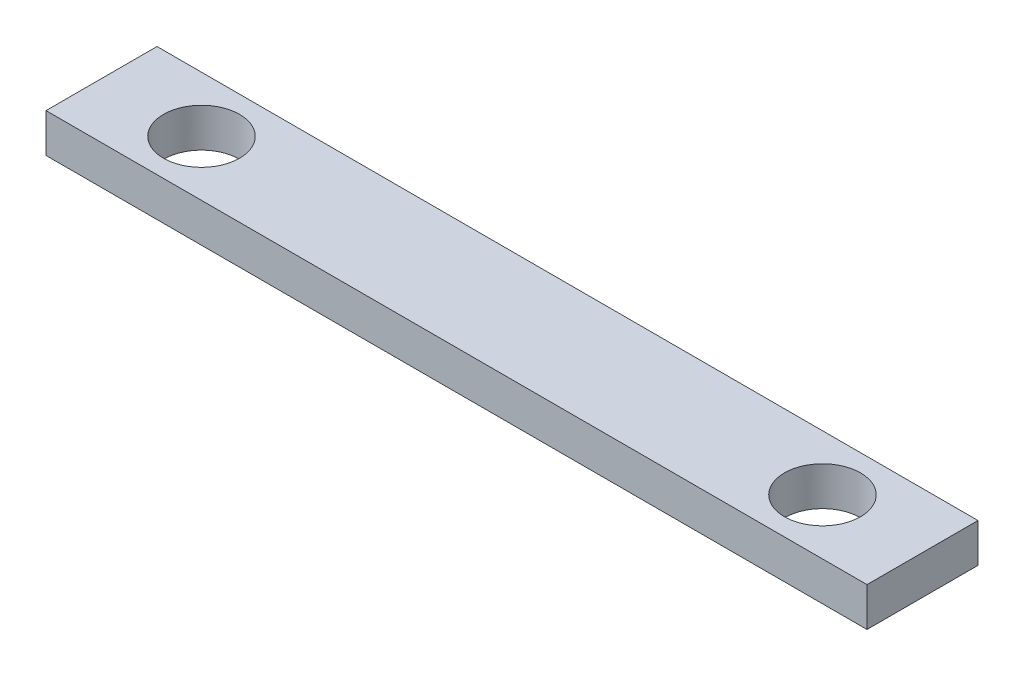
ISO-10303-21;
HEADER;
FILE_DESCRIPTION(('STEP AP214'),'2;1');
FILE_NAME('part.step','',(''),(''),'','','');
FILE_SCHEMA(('AUTOMOTIVE_DESIGN { 1 0 10303 214 1 1 1 1 }'));
ENDSEC;
DATA;
#1=APPLICATION_CONTEXT('core data for automotive mechanical design processes');
#2=APPLICATION_PROTOCOL_DEFINITION('international standard','automotive_design',2000,#1);
#3=PRODUCT_CONTEXT('',#1,'mechanical');
#4=PRODUCT('Part','Part','',(#3));
#5=PRODUCT_RELATED_PRODUCT_CATEGORY('part','',(#4));
#6=PRODUCT_DEFINITION_FORMATION('','',#4);
#7=PRODUCT_DEFINITION_CONTEXT('part definition',#1,'design');
#8=PRODUCT_DEFINITION('design','',#6,#7);
#9=PRODUCT_DEFINITION_SHAPE('','',#8);
#10=(LENGTH_UNIT() NAMED_UNIT(*) SI_UNIT(.MILLI.,.METRE.));
#11=(NAMED_UNIT(*) PLANE_ANGLE_UNIT() SI_UNIT($,.RADIAN.));
#12=(NAMED_UNIT(*) SI_UNIT($,.STERADIAN.) SOLID_ANGLE_UNIT());
#13=UNCERTAINTY_MEASURE_WITH_UNIT(LENGTH_MEASURE(1.E-05),#10,'distance_accuracy_value','');
#14=(GEOMETRIC_REPRESENTATION_CONTEXT(3) GLOBAL_UNCERTAINTY_ASSIGNED_CONTEXT((#13)) GLOBAL_UNIT_ASSIGNED_CONTEXT((#10,
#11,#12)) REPRESENTATION_CONTEXT('',''));
#15=CARTESIAN_POINT('',(0.,0.,0.));
#16=DIRECTION('',(0.,0.,1.));
#17=DIRECTION('',(1.,0.,0.));
#18=AXIS2_PLACEMENT_3D('',#15,#16,#17);
#19=CARTESIAN_POINT('',(49.7586,16.383,-25.654));
#20=DIRECTION('',(0.,1.,0.));
#21=DIRECTION('',(-1.,0.,0.));
#22=AXIS2_PLACEMENT_3D('',#19,#20,#21);
#23=PLANE('',#22);
#24=DIRECTION('',(0.,0.,-1.));
#25=VECTOR('',#24,1.);
#26=CARTESIAN_POINT('',(12.7508,16.383,-5.0038));
#27=LINE('',#26,#25);
#28=CARTESIAN_POINT('',(12.7508,16.383,0.));
#29=VERTEX_POINT('',#28);
#30=CARTESIAN_POINT('',(12.7508,16.383,-5.0038));
#31=VERTEX_POINT('',#30);
#32=EDGE_CURVE('E73',#29,#31,#27,.T.);
#33=ORIENTED_EDGE('',*,*,#32,.F.);
#34=DIRECTION('',(-1.,0.,0.));
#35=VECTOR('',#34,1.);
#36=CARTESIAN_POINT('',(49.7586,16.383,0.));
#37=LINE('',#36,#35);
#38=CARTESIAN_POINT('',(49.7586,16.383,0.));
#39=VERTEX_POINT('',#38);
#40=EDGE_CURVE('E84',#39,#29,#37,.T.);
#41=ORIENTED_EDGE('',*,*,#40,.F.);
#42=DIRECTION('',(0.,0.,1.));
#43=VECTOR('',#42,1.);
#44=CARTESIAN_POINT('',(49.7586,16.383,-25.654));
#45=LINE('',#44,#43);
#46=CARTESIAN_POINT('',(49.7586,16.383,-5.0038));
#47=VERTEX_POINT('',#46);
#48=EDGE_CURVE('E91',#47,#39,#45,.T.);
#49=ORIENTED_EDGE('',*,*,#48,.F.);
#50=DIRECTION('',(1.,0.,0.));
#51=VECTOR('',#50,1.);
#52=CARTESIAN_POINT('',(0.,16.383,-5.0038));
#53=LINE('',#52,#51);
#54=EDGE_CURVE('E85',#31,#47,#53,.T.);
#55=ORIENTED_EDGE('',*,*,#54,.F.);
#56=EDGE_LOOP('',(#33,#41,#49,#55));
#57=FACE_BOUND('',#56,.T.);
#58=CARTESIAN_POINT('',(17.2593,16.383,-2.5019));
#59=DIRECTION('',(0.,-1.,0.));
#60=DIRECTION('',(0.,0.,-1.));
#61=AXIS2_PLACEMENT_3D('',#58,#59,#60);
#62=CIRCLE('',#61,1.7145);
#63=CARTESIAN_POINT('',(17.2593,16.383,-4.2164));
#64=VERTEX_POINT('',#63);
#65=EDGE_CURVE('E117',#64,#64,#62,.T.);
#66=ORIENTED_EDGE('',*,*,#65,.T.);
#67=EDGE_LOOP('',(#66));
#68=FACE_BOUND('',#67,.T.);
#69=CARTESIAN_POINT('',(45.2501,16.383,-2.5019));
#70=DIRECTION('',(0.,-1.,0.));
#71=DIRECTION('',(0.,0.,-1.));
#72=AXIS2_PLACEMENT_3D('',#69,#70,#71);
#73=CIRCLE('',#72,1.7145);
#74=CARTESIAN_POINT('',(45.2501,16.383,-4.2164));
#75=VERTEX_POINT('',#74);
#76=EDGE_CURVE('E95',#75,#75,#73,.T.);
#77=ORIENTED_EDGE('',*,*,#76,.T.);
#78=EDGE_LOOP('',(#77));
#79=FACE_BOUND('',#78,.T.);
#80=ADVANCED_FACE('F33',(#57,#68,#79),#23,.T.);
#81=CARTESIAN_POINT('',(53.0606,11.7996563490699,0.));
#82=DIRECTION('',(0.,0.,-1.));
#83=DIRECTION('',(-1.,0.,0.));
#84=AXIS2_PLACEMENT_3D('',#81,#82,#83);
#85=PLANE('',#84);
#86=ORIENTED_EDGE('',*,*,#40,.T.);
#87=DIRECTION('',(0.,1.,0.));
#88=VECTOR('',#87,1.);
#89=CARTESIAN_POINT('',(12.7508,13.843,0.));
#90=LINE('',#89,#88);
#91=CARTESIAN_POINT('',(12.7508,14.6304,0.));
#92=VERTEX_POINT('',#91);
#93=EDGE_CURVE('E70',#92,#29,#90,.T.);
#94=ORIENTED_EDGE('',*,*,#93,.F.);
#95=DIRECTION('',(-1.,0.,0.));
#96=VECTOR('',#95,1.);
#97=CARTESIAN_POINT('',(49.7586,14.6304,0.));
#98=LINE('',#97,#96);
#99=CARTESIAN_POINT('',(49.7586,14.6304,0.));
#100=VERTEX_POINT('',#99);
#101=EDGE_CURVE('E105',#100,#92,#98,.T.);
#102=ORIENTED_EDGE('',*,*,#101,.F.);
#103=DIRECTION('',(0.,1.,0.));
#104=VECTOR('',#103,1.);
#105=CARTESIAN_POINT('',(49.7586,11.7996563490699,0.));
#106=LINE('',#105,#104);
#107=EDGE_CURVE('E89',#100,#39,#106,.T.);
#108=ORIENTED_EDGE('',*,*,#107,.T.);
#109=EDGE_LOOP('',(#86,#94,#102,#108));
#110=FACE_BOUND('',#109,.T.);
#111=ADVANCED_FACE('F87',(#110),#85,.F.);
#112=CARTESIAN_POINT('',(0.,16.383,-5.0038));
#113=DIRECTION('',(0.,0.,1.));
#114=DIRECTION('',(0.,-1.,0.));
#115=AXIS2_PLACEMENT_3D('',#112,#113,#114);
#116=PLANE('',#115);
#117=DIRECTION('',(-1.,0.,0.));
#118=VECTOR('',#117,1.);
#119=CARTESIAN_POINT('',(0.,14.6304,-5.0038));
#120=LINE('',#119,#118);
#121=CARTESIAN_POINT('',(49.7586,14.6304,-5.0038));
#122=VERTEX_POINT('',#121);
#123=CARTESIAN_POINT('',(12.7508,14.6304,-5.0038));
#124=VERTEX_POINT('',#123);
#125=EDGE_CURVE('E53',#122,#124,#120,.T.);
#126=ORIENTED_EDGE('',*,*,#125,.T.);
#127=DIRECTION('',(0.,1.,0.));
#128=VECTOR('',#127,1.);
#129=CARTESIAN_POINT('',(12.7508,13.843,-5.0038));
#130=LINE('',#129,#128);
#131=EDGE_CURVE('E47',#124,#31,#130,.T.);
#132=ORIENTED_EDGE('',*,*,#131,.T.);
#133=ORIENTED_EDGE('',*,*,#54,.T.);
#134=DIRECTION('',(0.,-1.,0.));
#135=VECTOR('',#134,1.);
#136=CARTESIAN_POINT('',(49.7586,16.383,-5.0038));
#137=LINE('',#136,#135);
#138=EDGE_CURVE('E93',#47,#122,#137,.T.);
#139=ORIENTED_EDGE('',*,*,#138,.T.);
#140=EDGE_LOOP('',(#126,#132,#133,#139));
#141=FACE_BOUND('',#140,.T.);
#142=ADVANCED_FACE('F104',(#141),#116,.F.);
#143=CARTESIAN_POINT('',(45.2501,16.383,-2.5019));
#144=DIRECTION('',(0.,-1.,0.));
#145=DIRECTION('',(0.,0.,-1.));
#146=AXIS2_PLACEMENT_3D('',#143,#144,#145);
#147=CYLINDRICAL_SURFACE('',#146,1.7145);
#148=CARTESIAN_POINT('',(45.2501,14.6304,-2.5019));
#149=DIRECTION('',(0.,1.,0.));
#150=DIRECTION('',(-1.,0.,0.));
#151=AXIS2_PLACEMENT_3D('',#148,#149,#150);
#152=CIRCLE('',#151,1.7145);
#153=CARTESIAN_POINT('',(43.5356,14.6304,-2.5019));
#154=VERTEX_POINT('',#153);
#155=EDGE_CURVE('E112',#154,#154,#152,.F.);
#156=ORIENTED_EDGE('',*,*,#155,.T.);
#157=EDGE_LOOP('',(#156));
#158=FACE_BOUND('',#157,.T.);
#159=ORIENTED_EDGE('',*,*,#76,.F.);
#160=EDGE_LOOP('',(#159));
#161=FACE_BOUND('',#160,.T.);
#162=ADVANCED_FACE('F123',(#158,#161),#147,.F.);
#163=CARTESIAN_POINT('',(17.2593,16.383,-2.5019));
#164=DIRECTION('',(0.,-1.,0.));
#165=DIRECTION('',(0.,0.,-1.));
#166=AXIS2_PLACEMENT_3D('',#163,#164,#165);
#167=CYLINDRICAL_SURFACE('',#166,1.7145);
#168=CARTESIAN_POINT('',(17.2593,14.6304,-2.5019));
#169=DIRECTION('',(0.,1.,0.));
#170=DIRECTION('',(-1.,0.,0.));
#171=AXIS2_PLACEMENT_3D('',#168,#169,#170);
#172=CIRCLE('',#171,1.7145);
#173=CARTESIAN_POINT('',(15.5448,14.6304,-2.5019));
#174=VERTEX_POINT('',#173);
#175=EDGE_CURVE('E107',#174,#174,#172,.F.);
#176=ORIENTED_EDGE('',*,*,#175,.T.);
#177=EDGE_LOOP('',(#176));
#178=FACE_BOUND('',#177,.T.);
#179=ORIENTED_EDGE('',*,*,#65,.F.);
#180=EDGE_LOOP('',(#179));
#181=FACE_BOUND('',#180,.T.);
#182=ADVANCED_FACE('F125',(#178,#181),#167,.F.);
#183=CARTESIAN_POINT('',(49.7586,0.,1.06644526557301));
#184=DIRECTION('',(-1.,0.,0.));
#185=DIRECTION('',(0.,0.,1.));
#186=AXIS2_PLACEMENT_3D('',#183,#184,#185);
#187=PLANE('',#186);
#188=ORIENTED_EDGE('',*,*,#107,.F.);
#189=DIRECTION('',(0.,0.,-1.));
#190=VECTOR('',#189,1.);
#191=CARTESIAN_POINT('',(49.7586,14.6304,1.06644526557301));
#192=LINE('',#191,#190);
#193=EDGE_CURVE('E40',#100,#122,#192,.T.);
#194=ORIENTED_EDGE('',*,*,#193,.T.);
#195=ORIENTED_EDGE('',*,*,#138,.F.);
#196=ORIENTED_EDGE('',*,*,#48,.T.);
#197=EDGE_LOOP('',(#188,#194,#195,#196));
#198=FACE_BOUND('',#197,.T.);
#199=ADVANCED_FACE('F102',(#198),#187,.F.);
#200=CARTESIAN_POINT('',(49.7586,14.6304,-25.654));
#201=DIRECTION('',(0.,1.,0.));
#202=DIRECTION('',(-1.,0.,0.));
#203=AXIS2_PLACEMENT_3D('',#200,#201,#202);
#204=PLANE('',#203);
#205=ORIENTED_EDGE('',*,*,#155,.F.);
#206=EDGE_LOOP('',(#205));
#207=FACE_BOUND('',#206,.T.);
#208=ORIENTED_EDGE('',*,*,#175,.F.);
#209=EDGE_LOOP('',(#208));
#210=FACE_BOUND('',#209,.T.);
#211=ORIENTED_EDGE('',*,*,#101,.T.);
#212=DIRECTION('',(0.,0.,-1.));
#213=VECTOR('',#212,1.);
#214=CARTESIAN_POINT('',(12.7508000000001,14.6304,-25.6540000000001));
#215=LINE('',#214,#213);
#216=EDGE_CURVE('E11',#92,#124,#215,.T.);
#217=ORIENTED_EDGE('',*,*,#216,.T.);
#218=ORIENTED_EDGE('',*,*,#125,.F.);
#219=ORIENTED_EDGE('',*,*,#193,.F.);
#220=EDGE_LOOP('',(#211,#217,#218,#219));
#221=FACE_BOUND('',#220,.T.);
#222=ADVANCED_FACE('F149',(#207,#210,#221),#204,.F.);
#223=CARTESIAN_POINT('',(12.7508,13.843,-5.0038));
#224=DIRECTION('',(1.,0.,0.));
#225=DIRECTION('',(0.,0.,-1.));
#226=AXIS2_PLACEMENT_3D('',#223,#224,#225);
#227=PLANE('',#226);
#228=ORIENTED_EDGE('',*,*,#93,.T.);
#229=ORIENTED_EDGE('',*,*,#32,.T.);
#230=ORIENTED_EDGE('',*,*,#131,.F.);
#231=ORIENTED_EDGE('',*,*,#216,.F.);
#232=EDGE_LOOP('',(#228,#229,#230,#231));
#233=FACE_BOUND('',#232,.T.);
#234=ADVANCED_FACE('F72',(#233),#227,.F.);
#235=CLOSED_SHELL('',(#80,#111,#142,#162,#182,#199,#222,#234));
#236=MANIFOLD_SOLID_BREP('B2',#235);
#237=ADVANCED_BREP_SHAPE_REPRESENTATION('',(#18,#236),#14);
#238=SHAPE_DEFINITION_REPRESENTATION(#9,#237);
ENDSEC;
END-ISO-10303-21;
